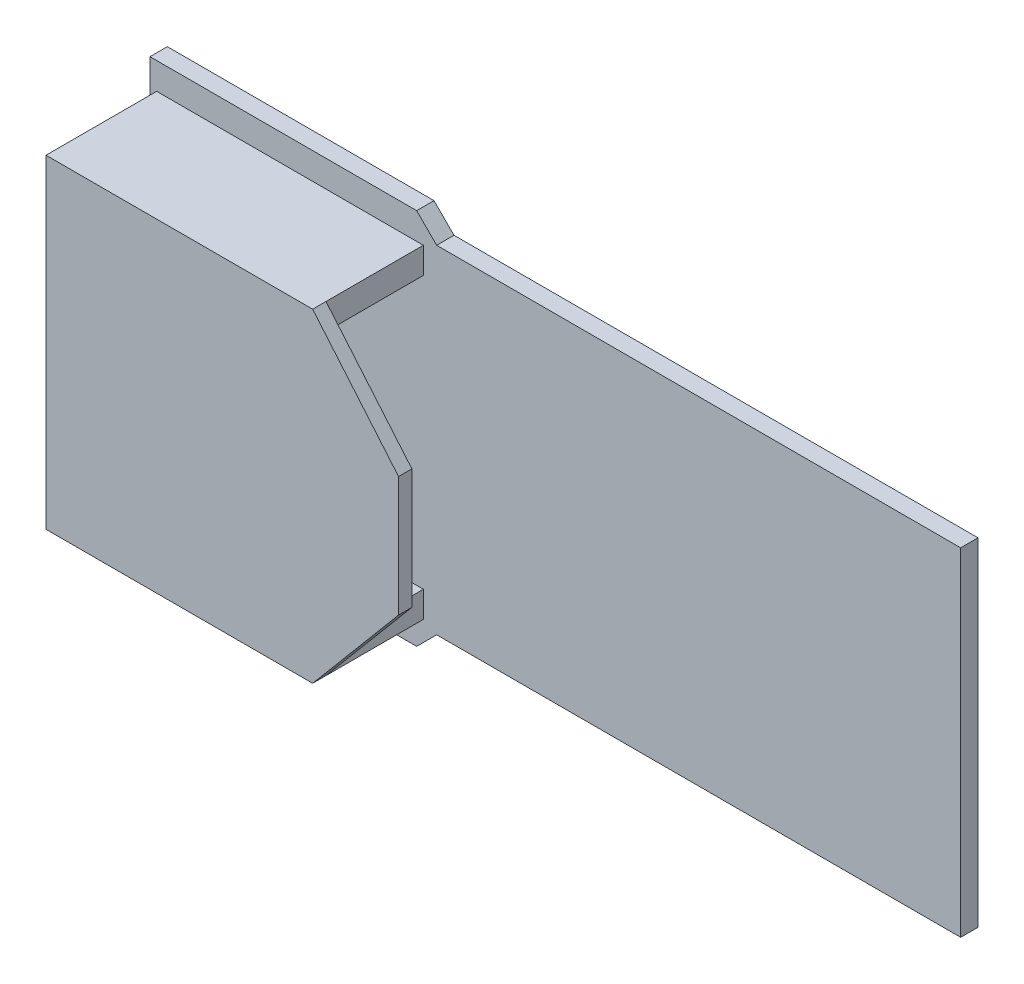
ISO-10303-21;
HEADER;
FILE_DESCRIPTION(('STEP AP214'),'2;1');
FILE_NAME('part.step','',(''),(''),'','','');
FILE_SCHEMA(('AUTOMOTIVE_DESIGN { 1 0 10303 214 1 1 1 1 }'));
ENDSEC;
DATA;
#1=APPLICATION_CONTEXT('core data for automotive mechanical design processes');
#2=APPLICATION_PROTOCOL_DEFINITION('international standard','automotive_design',2000,#1);
#3=PRODUCT_CONTEXT('',#1,'mechanical');
#4=PRODUCT('Part','Part','',(#3));
#5=PRODUCT_RELATED_PRODUCT_CATEGORY('part','',(#4));
#6=PRODUCT_DEFINITION_FORMATION('','',#4);
#7=PRODUCT_DEFINITION_CONTEXT('part definition',#1,'design');
#8=PRODUCT_DEFINITION('design','',#6,#7);
#9=PRODUCT_DEFINITION_SHAPE('','',#8);
#10=(LENGTH_UNIT() NAMED_UNIT(*) SI_UNIT(.MILLI.,.METRE.));
#11=(NAMED_UNIT(*) PLANE_ANGLE_UNIT() SI_UNIT($,.RADIAN.));
#12=(NAMED_UNIT(*) SI_UNIT($,.STERADIAN.) SOLID_ANGLE_UNIT());
#13=UNCERTAINTY_MEASURE_WITH_UNIT(LENGTH_MEASURE(1.E-05),#10,'distance_accuracy_value','');
#14=(GEOMETRIC_REPRESENTATION_CONTEXT(3) GLOBAL_UNCERTAINTY_ASSIGNED_CONTEXT((#13)) GLOBAL_UNIT_ASSIGNED_CONTEXT((#10,
#11,#12)) REPRESENTATION_CONTEXT('',''));
#15=CARTESIAN_POINT('',(0.,0.,0.));
#16=DIRECTION('',(0.,0.,1.));
#17=DIRECTION('',(1.,0.,0.));
#18=AXIS2_PLACEMENT_3D('',#15,#16,#17);
#19=CARTESIAN_POINT('',(0.,0.,1.3));
#20=DIRECTION('',(0.,0.,-1.));
#21=DIRECTION('',(-1.,0.,0.));
#22=AXIS2_PLACEMENT_3D('',#19,#20,#21);
#23=PLANE('',#22);
#24=DIRECTION('',(0.,-1.,0.));
#25=VECTOR('',#24,1.);
#26=CARTESIAN_POINT('',(0.5,10.1907854445176,1.3));
#27=LINE('',#26,#25);
#28=CARTESIAN_POINT('',(0.5,12.15,1.3));
#29=VERTEX_POINT('',#28);
#30=CARTESIAN_POINT('',(0.5,10.1907854445176,1.3));
#31=VERTEX_POINT('',#30);
#32=EDGE_CURVE('E995',#29,#31,#27,.T.);
#33=ORIENTED_EDGE('',*,*,#32,.F.);
#34=DIRECTION('',(-1.,0.,0.));
#35=VECTOR('',#34,1.);
#36=CARTESIAN_POINT('',(0.5,12.15,1.3));
#37=LINE('',#36,#35);
#38=CARTESIAN_POINT('',(20.5,12.15,1.3));
#39=VERTEX_POINT('',#38);
#40=EDGE_CURVE('E267',#39,#29,#37,.T.);
#41=ORIENTED_EDGE('',*,*,#40,.F.);
#42=DIRECTION('',(0.,1.,0.));
#43=VECTOR('',#42,1.);
#44=CARTESIAN_POINT('',(20.5,10.1907854445176,1.3));
#45=LINE('',#44,#43);
#46=CARTESIAN_POINT('',(20.5,10.1907854445176,1.3));
#47=VERTEX_POINT('',#46);
#48=EDGE_CURVE('E998',#47,#39,#45,.T.);
#49=ORIENTED_EDGE('',*,*,#48,.F.);
#50=DIRECTION('',(1.,0.,0.));
#51=VECTOR('',#50,1.);
#52=CARTESIAN_POINT('',(0.5,10.1907854445176,1.3));
#53=LINE('',#52,#51);
#54=EDGE_CURVE('E996',#31,#47,#53,.T.);
#55=ORIENTED_EDGE('',*,*,#54,.F.);
#56=EDGE_LOOP('',(#33,#41,#49,#55));
#57=FACE_BOUND('',#56,.T.);
#58=DIRECTION('',(1.,0.,0.));
#59=VECTOR('',#58,1.);
#60=CARTESIAN_POINT('',(21.5,-12.65,1.3));
#61=LINE('',#60,#59);
#62=CARTESIAN_POINT('',(21.5,-12.65,1.3));
#63=VERTEX_POINT('',#62);
#64=CARTESIAN_POINT('',(60.8,-12.65,1.3));
#65=VERTEX_POINT('',#64);
#66=EDGE_CURVE('E498',#63,#65,#61,.T.);
#67=ORIENTED_EDGE('',*,*,#66,.T.);
#68=DIRECTION('',(0.,1.,0.));
#69=VECTOR('',#68,1.);
#70=CARTESIAN_POINT('',(60.8,12.65,1.3));
#71=LINE('',#70,#69);
#72=CARTESIAN_POINT('',(60.8,12.65,1.3));
#73=VERTEX_POINT('',#72);
#74=EDGE_CURVE('E503',#65,#73,#71,.T.);
#75=ORIENTED_EDGE('',*,*,#74,.T.);
#76=DIRECTION('',(-1.,0.,0.));
#77=VECTOR('',#76,1.);
#78=CARTESIAN_POINT('',(21.5,12.65,1.3));
#79=LINE('',#78,#77);
#80=CARTESIAN_POINT('',(21.5,12.65,1.3));
#81=VERTEX_POINT('',#80);
#82=EDGE_CURVE('E567',#73,#81,#79,.T.);
#83=ORIENTED_EDGE('',*,*,#82,.T.);
#84=DIRECTION('',(-0.707106781186557,0.707106781186539,0.));
#85=VECTOR('',#84,1.);
#86=CARTESIAN_POINT('',(20.,14.15,1.3));
#87=LINE('',#86,#85);
#88=CARTESIAN_POINT('',(20.,14.15,1.3));
#89=VERTEX_POINT('',#88);
#90=EDGE_CURVE('E569',#81,#89,#87,.T.);
#91=ORIENTED_EDGE('',*,*,#90,.T.);
#92=DIRECTION('',(-1.,0.,0.));
#93=VECTOR('',#92,1.);
#94=CARTESIAN_POINT('',(0.,14.15,1.3));
#95=LINE('',#94,#93);
#96=CARTESIAN_POINT('',(0.,14.15,1.3));
#97=VERTEX_POINT('',#96);
#98=EDGE_CURVE('E571',#89,#97,#95,.T.);
#99=ORIENTED_EDGE('',*,*,#98,.T.);
#100=DIRECTION('',(0.,-1.,0.));
#101=VECTOR('',#100,1.);
#102=CARTESIAN_POINT('',(0.,-14.15,1.3));
#103=LINE('',#102,#101);
#104=CARTESIAN_POINT('',(0.,-14.15,1.3));
#105=VERTEX_POINT('',#104);
#106=EDGE_CURVE('E547',#97,#105,#103,.T.);
#107=ORIENTED_EDGE('',*,*,#106,.T.);
#108=DIRECTION('',(1.,0.,0.));
#109=VECTOR('',#108,1.);
#110=CARTESIAN_POINT('',(0.,-14.15,1.3));
#111=LINE('',#110,#109);
#112=CARTESIAN_POINT('',(20.,-14.15,1.3));
#113=VERTEX_POINT('',#112);
#114=EDGE_CURVE('E573',#105,#113,#111,.T.);
#115=ORIENTED_EDGE('',*,*,#114,.T.);
#116=DIRECTION('',(0.707106781186557,0.707106781186538,0.));
#117=VECTOR('',#116,1.);
#118=CARTESIAN_POINT('',(20.,-14.15,1.3));
#119=LINE('',#118,#117);
#120=EDGE_CURVE('E496',#113,#63,#119,.T.);
#121=ORIENTED_EDGE('',*,*,#120,.T.);
#122=EDGE_LOOP('',(#67,#75,#83,#91,#99,#107,#115,#121));
#123=FACE_BOUND('',#122,.T.);
#124=DIRECTION('',(0.,-1.,0.));
#125=VECTOR('',#124,1.);
#126=CARTESIAN_POINT('',(0.5,-10.1907854445176,1.3));
#127=LINE('',#126,#125);
#128=CARTESIAN_POINT('',(0.5,-10.1907854445176,1.3));
#129=VERTEX_POINT('',#128);
#130=CARTESIAN_POINT('',(0.5,-12.15,1.3));
#131=VERTEX_POINT('',#130);
#132=EDGE_CURVE('E317',#129,#131,#127,.T.);
#133=ORIENTED_EDGE('',*,*,#132,.F.);
#134=DIRECTION('',(-1.,0.,0.));
#135=VECTOR('',#134,1.);
#136=CARTESIAN_POINT('',(0.5,-10.1907854445176,1.3));
#137=LINE('',#136,#135);
#138=CARTESIAN_POINT('',(20.5,-10.1907854445176,1.3));
#139=VERTEX_POINT('',#138);
#140=EDGE_CURVE('E314',#139,#129,#137,.T.);
#141=ORIENTED_EDGE('',*,*,#140,.F.);
#142=DIRECTION('',(0.,1.,0.));
#143=VECTOR('',#142,1.);
#144=CARTESIAN_POINT('',(20.5,-10.1907854445176,1.3));
#145=LINE('',#144,#143);
#146=CARTESIAN_POINT('',(20.5,-12.15,1.3));
#147=VERTEX_POINT('',#146);
#148=EDGE_CURVE('E54',#147,#139,#145,.T.);
#149=ORIENTED_EDGE('',*,*,#148,.F.);
#150=DIRECTION('',(1.,0.,0.));
#151=VECTOR('',#150,1.);
#152=CARTESIAN_POINT('',(0.5,-12.15,1.3));
#153=LINE('',#152,#151);
#154=EDGE_CURVE('E49',#131,#147,#153,.T.);
#155=ORIENTED_EDGE('',*,*,#154,.F.);
#156=EDGE_LOOP('',(#133,#141,#149,#155));
#157=FACE_BOUND('',#156,.T.);
#158=ADVANCED_FACE('F32',(#57,#123,#157),#23,.F.);
#159=CARTESIAN_POINT('',(0.,-14.15,1.3));
#160=DIRECTION('',(1.,0.,0.));
#161=DIRECTION('',(0.,0.,-1.));
#162=AXIS2_PLACEMENT_3D('',#159,#160,#161);
#163=PLANE('',#162);
#164=DIRECTION('',(0.,-1.,0.));
#165=VECTOR('',#164,1.);
#166=CARTESIAN_POINT('',(0.,-14.15,0.));
#167=LINE('',#166,#165);
#168=CARTESIAN_POINT('',(0.,14.15,0.));
#169=VERTEX_POINT('',#168);
#170=CARTESIAN_POINT('',(0.,8.15,0.));
#171=VERTEX_POINT('',#170);
#172=EDGE_CURVE('E474',#169,#171,#167,.T.);
#173=ORIENTED_EDGE('',*,*,#172,.T.);
#174=DIRECTION('',(0.,0.,1.));
#175=VECTOR('',#174,1.);
#176=CARTESIAN_POINT('',(0.,8.15,-4.));
#177=LINE('',#176,#175);
#178=CARTESIAN_POINT('',(0.,8.15,-4.));
#179=VERTEX_POINT('',#178);
#180=EDGE_CURVE('E523',#179,#171,#177,.T.);
#181=ORIENTED_EDGE('',*,*,#180,.F.);
#182=DIRECTION('',(0.,-1.,0.));
#183=VECTOR('',#182,1.);
#184=CARTESIAN_POINT('',(0.,8.15,-4.));
#185=LINE('',#184,#183);
#186=CARTESIAN_POINT('',(0.,1.15,-4.));
#187=VERTEX_POINT('',#186);
#188=EDGE_CURVE('E438',#179,#187,#185,.T.);
#189=ORIENTED_EDGE('',*,*,#188,.T.);
#190=DIRECTION('',(0.,0.,1.));
#191=VECTOR('',#190,1.);
#192=CARTESIAN_POINT('',(0.,1.15,-4.));
#193=LINE('',#192,#191);
#194=CARTESIAN_POINT('',(0.,1.15,0.));
#195=VERTEX_POINT('',#194);
#196=EDGE_CURVE('E449',#187,#195,#193,.T.);
#197=ORIENTED_EDGE('',*,*,#196,.T.);
#198=CARTESIAN_POINT('',(0.,-2.15,0.));
#199=VERTEX_POINT('',#198);
#200=EDGE_CURVE('E461',#195,#199,#167,.T.);
#201=ORIENTED_EDGE('',*,*,#200,.T.);
#202=DIRECTION('',(0.,0.,1.));
#203=VECTOR('',#202,1.);
#204=CARTESIAN_POINT('',(0.,-2.15,-6.));
#205=LINE('',#204,#203);
#206=CARTESIAN_POINT('',(0.,-2.15,-6.));
#207=VERTEX_POINT('',#206);
#208=EDGE_CURVE('E435',#207,#199,#205,.T.);
#209=ORIENTED_EDGE('',*,*,#208,.F.);
#210=DIRECTION('',(0.,1.,0.));
#211=VECTOR('',#210,1.);
#212=CARTESIAN_POINT('',(0.,-10.15,-6.));
#213=LINE('',#212,#211);
#214=CARTESIAN_POINT('',(0.,-10.15,-6.));
#215=VERTEX_POINT('',#214);
#216=EDGE_CURVE('E409',#215,#207,#213,.T.);
#217=ORIENTED_EDGE('',*,*,#216,.F.);
#218=DIRECTION('',(0.,0.,1.));
#219=VECTOR('',#218,1.);
#220=CARTESIAN_POINT('',(0.,-10.15,-6.));
#221=LINE('',#220,#219);
#222=CARTESIAN_POINT('',(0.,-10.15,0.));
#223=VERTEX_POINT('',#222);
#224=EDGE_CURVE('E421',#215,#223,#221,.T.);
#225=ORIENTED_EDGE('',*,*,#224,.T.);
#226=CARTESIAN_POINT('',(0.,-14.15,0.));
#227=VERTEX_POINT('',#226);
#228=EDGE_CURVE('E459',#223,#227,#167,.T.);
#229=ORIENTED_EDGE('',*,*,#228,.T.);
#230=DIRECTION('',(0.,0.,-1.));
#231=VECTOR('',#230,1.);
#232=CARTESIAN_POINT('',(0.,-14.15,1.3));
#233=LINE('',#232,#231);
#234=EDGE_CURVE('E488',#105,#227,#233,.T.);
#235=ORIENTED_EDGE('',*,*,#234,.F.);
#236=ORIENTED_EDGE('',*,*,#106,.F.);
#237=DIRECTION('',(0.,0.,-1.));
#238=VECTOR('',#237,1.);
#239=CARTESIAN_POINT('',(0.,14.15,1.3));
#240=LINE('',#239,#238);
#241=EDGE_CURVE('E485',#97,#169,#240,.T.);
#242=ORIENTED_EDGE('',*,*,#241,.T.);
#243=EDGE_LOOP('',(#173,#181,#189,#197,#201,#209,#217,#225,#229,#235,#236,#242));
#244=FACE_BOUND('',#243,.T.);
#245=DIRECTION('',(0.,0.,-1.));
#246=VECTOR('',#245,1.);
#247=CARTESIAN_POINT('',(0.,7.65,-3.5));
#248=LINE('',#247,#246);
#249=CARTESIAN_POINT('',(0.,7.65,-0.5));
#250=VERTEX_POINT('',#249);
#251=CARTESIAN_POINT('',(0.,7.65,-3.5));
#252=VERTEX_POINT('',#251);
#253=EDGE_CURVE('E392',#250,#252,#248,.T.);
#254=ORIENTED_EDGE('',*,*,#253,.F.);
#255=DIRECTION('',(0.,1.,0.));
#256=VECTOR('',#255,1.);
#257=CARTESIAN_POINT('',(0.,1.65,-0.5));
#258=LINE('',#257,#256);
#259=CARTESIAN_POINT('',(0.,1.65,-0.5));
#260=VERTEX_POINT('',#259);
#261=EDGE_CURVE('E376',#260,#250,#258,.T.);
#262=ORIENTED_EDGE('',*,*,#261,.F.);
#263=DIRECTION('',(0.,0.,1.));
#264=VECTOR('',#263,1.);
#265=CARTESIAN_POINT('',(0.,1.65,-3.5));
#266=LINE('',#265,#264);
#267=CARTESIAN_POINT('',(0.,1.65,-3.5));
#268=VERTEX_POINT('',#267);
#269=EDGE_CURVE('E381',#268,#260,#266,.T.);
#270=ORIENTED_EDGE('',*,*,#269,.F.);
#271=DIRECTION('',(0.,-1.,0.));
#272=VECTOR('',#271,1.);
#273=CARTESIAN_POINT('',(0.,1.65,-3.5));
#274=LINE('',#273,#272);
#275=EDGE_CURVE('E395',#252,#268,#274,.T.);
#276=ORIENTED_EDGE('',*,*,#275,.F.);
#277=EDGE_LOOP('',(#254,#262,#270,#276));
#278=FACE_BOUND('',#277,.T.);
#279=DIRECTION('',(0.,1.,0.));
#280=VECTOR('',#279,1.);
#281=CARTESIAN_POINT('',(0.,-9.65,-5.5));
#282=LINE('',#281,#280);
#283=CARTESIAN_POINT('',(0.,-9.65,-5.5));
#284=VERTEX_POINT('',#283);
#285=CARTESIAN_POINT('',(0.,-2.65,-5.5));
#286=VERTEX_POINT('',#285);
#287=EDGE_CURVE('E332',#284,#286,#282,.T.);
#288=ORIENTED_EDGE('',*,*,#287,.T.);
#289=DIRECTION('',(0.,0.,1.));
#290=VECTOR('',#289,1.);
#291=CARTESIAN_POINT('',(0.,-2.65,-5.5));
#292=LINE('',#291,#290);
#293=CARTESIAN_POINT('',(0.,-2.65,-0.5));
#294=VERTEX_POINT('',#293);
#295=EDGE_CURVE('E338',#286,#294,#292,.T.);
#296=ORIENTED_EDGE('',*,*,#295,.T.);
#297=DIRECTION('',(0.,1.,0.));
#298=VECTOR('',#297,1.);
#299=CARTESIAN_POINT('',(0.,-9.65,-0.5));
#300=LINE('',#299,#298);
#301=CARTESIAN_POINT('',(0.,-9.65,-0.5));
#302=VERTEX_POINT('',#301);
#303=EDGE_CURVE('E362',#302,#294,#300,.T.);
#304=ORIENTED_EDGE('',*,*,#303,.F.);
#305=DIRECTION('',(0.,0.,1.));
#306=VECTOR('',#305,1.);
#307=CARTESIAN_POINT('',(0.,-9.65,-5.5));
#308=LINE('',#307,#306);
#309=EDGE_CURVE('E351',#284,#302,#308,.T.);
#310=ORIENTED_EDGE('',*,*,#309,.F.);
#311=EDGE_LOOP('',(#288,#296,#304,#310));
#312=FACE_BOUND('',#311,.T.);
#313=ADVANCED_FACE('F545',(#244,#278,#312),#163,.F.);
#314=CARTESIAN_POINT('',(0.,0.,0.));
#315=DIRECTION('',(0.,0.,-1.));
#316=DIRECTION('',(-1.,0.,0.));
#317=AXIS2_PLACEMENT_3D('',#314,#315,#316);
#318=PLANE('',#317);
#319=DIRECTION('',(0.,1.,0.));
#320=VECTOR('',#319,1.);
#321=CARTESIAN_POINT('',(5.,-10.15,0.));
#322=LINE('',#321,#320);
#323=CARTESIAN_POINT('',(5.,-10.15,0.));
#324=VERTEX_POINT('',#323);
#325=CARTESIAN_POINT('',(5.,-2.15,0.));
#326=VERTEX_POINT('',#325);
#327=EDGE_CURVE('E424',#324,#326,#322,.T.);
#328=ORIENTED_EDGE('',*,*,#327,.T.);
#329=DIRECTION('',(1.,0.,0.));
#330=VECTOR('',#329,1.);
#331=CARTESIAN_POINT('',(0.,-2.15,0.));
#332=LINE('',#331,#330);
#333=EDGE_CURVE('E402',#199,#326,#332,.T.);
#334=ORIENTED_EDGE('',*,*,#333,.F.);
#335=ORIENTED_EDGE('',*,*,#200,.F.);
#336=DIRECTION('',(1.,0.,0.));
#337=VECTOR('',#336,1.);
#338=CARTESIAN_POINT('',(0.,1.15,0.));
#339=LINE('',#338,#337);
#340=CARTESIAN_POINT('',(8.,1.15,0.));
#341=VERTEX_POINT('',#340);
#342=EDGE_CURVE('E437',#195,#341,#339,.T.);
#343=ORIENTED_EDGE('',*,*,#342,.T.);
#344=DIRECTION('',(0.,-1.,0.));
#345=VECTOR('',#344,1.);
#346=CARTESIAN_POINT('',(8.,8.15,0.));
#347=LINE('',#346,#345);
#348=CARTESIAN_POINT('',(8.,8.15,0.));
#349=VERTEX_POINT('',#348);
#350=EDGE_CURVE('E452',#349,#341,#347,.T.);
#351=ORIENTED_EDGE('',*,*,#350,.F.);
#352=DIRECTION('',(1.,0.,0.));
#353=VECTOR('',#352,1.);
#354=CARTESIAN_POINT('',(0.,8.15,0.));
#355=LINE('',#354,#353);
#356=EDGE_CURVE('E442',#171,#349,#355,.T.);
#357=ORIENTED_EDGE('',*,*,#356,.F.);
#358=ORIENTED_EDGE('',*,*,#172,.F.);
#359=DIRECTION('',(-1.,0.,0.));
#360=VECTOR('',#359,1.);
#361=CARTESIAN_POINT('',(0.,14.15,0.));
#362=LINE('',#361,#360);
#363=CARTESIAN_POINT('',(20.,14.15,0.));
#364=VERTEX_POINT('',#363);
#365=EDGE_CURVE('E462',#364,#169,#362,.T.);
#366=ORIENTED_EDGE('',*,*,#365,.F.);
#367=DIRECTION('',(-0.707106781186557,0.707106781186539,0.));
#368=VECTOR('',#367,1.);
#369=CARTESIAN_POINT('',(20.,14.15,0.));
#370=LINE('',#369,#368);
#371=CARTESIAN_POINT('',(21.5,12.65,0.));
#372=VERTEX_POINT('',#371);
#373=EDGE_CURVE('E533',#372,#364,#370,.T.);
#374=ORIENTED_EDGE('',*,*,#373,.F.);
#375=DIRECTION('',(-1.,0.,0.));
#376=VECTOR('',#375,1.);
#377=CARTESIAN_POINT('',(21.5,12.65,0.));
#378=LINE('',#377,#376);
#379=CARTESIAN_POINT('',(60.8,12.65,0.));
#380=VERTEX_POINT('',#379);
#381=EDGE_CURVE('E525',#380,#372,#378,.T.);
#382=ORIENTED_EDGE('',*,*,#381,.F.);
#383=DIRECTION('',(0.,1.,0.));
#384=VECTOR('',#383,1.);
#385=CARTESIAN_POINT('',(60.8,12.65,0.));
#386=LINE('',#385,#384);
#387=CARTESIAN_POINT('',(60.8,-12.65,0.));
#388=VERTEX_POINT('',#387);
#389=EDGE_CURVE('E520',#388,#380,#386,.T.);
#390=ORIENTED_EDGE('',*,*,#389,.F.);
#391=DIRECTION('',(1.,0.,0.));
#392=VECTOR('',#391,1.);
#393=CARTESIAN_POINT('',(21.5,-12.65,0.));
#394=LINE('',#393,#392);
#395=CARTESIAN_POINT('',(21.5,-12.65,0.));
#396=VERTEX_POINT('',#395);
#397=EDGE_CURVE('E518',#396,#388,#394,.T.);
#398=ORIENTED_EDGE('',*,*,#397,.F.);
#399=DIRECTION('',(0.707106781186557,0.707106781186538,0.));
#400=VECTOR('',#399,1.);
#401=CARTESIAN_POINT('',(20.,-14.15,0.));
#402=LINE('',#401,#400);
#403=CARTESIAN_POINT('',(20.,-14.15,0.));
#404=VERTEX_POINT('',#403);
#405=EDGE_CURVE('E497',#404,#396,#402,.T.);
#406=ORIENTED_EDGE('',*,*,#405,.F.);
#407=DIRECTION('',(1.,0.,0.));
#408=VECTOR('',#407,1.);
#409=CARTESIAN_POINT('',(0.,-14.15,0.));
#410=LINE('',#409,#408);
#411=EDGE_CURVE('E467',#227,#404,#410,.T.);
#412=ORIENTED_EDGE('',*,*,#411,.F.);
#413=ORIENTED_EDGE('',*,*,#228,.F.);
#414=DIRECTION('',(1.,0.,0.));
#415=VECTOR('',#414,1.);
#416=CARTESIAN_POINT('',(0.,-10.15,0.));
#417=LINE('',#416,#415);
#418=EDGE_CURVE('E413',#223,#324,#417,.T.);
#419=ORIENTED_EDGE('',*,*,#418,.T.);
#420=EDGE_LOOP('',(#328,#334,#335,#343,#351,#357,#358,#366,#374,#382,#390,#398,#406,#412,#413,#419));
#421=FACE_BOUND('',#420,.T.);
#422=ADVANCED_FACE('F516',(#421),#318,.T.);
#423=CARTESIAN_POINT('',(21.5,-12.65,1.3));
#424=DIRECTION('',(0.,1.,0.));
#425=DIRECTION('',(-1.,0.,0.));
#426=AXIS2_PLACEMENT_3D('',#423,#424,#425);
#427=PLANE('',#426);
#428=ORIENTED_EDGE('',*,*,#397,.T.);
#429=DIRECTION('',(0.,0.,-1.));
#430=VECTOR('',#429,1.);
#431=CARTESIAN_POINT('',(60.8,-12.65,1.3));
#432=LINE('',#431,#430);
#433=EDGE_CURVE('E11',#65,#388,#432,.T.);
#434=ORIENTED_EDGE('',*,*,#433,.F.);
#435=ORIENTED_EDGE('',*,*,#66,.F.);
#436=DIRECTION('',(0.,0.,-1.));
#437=VECTOR('',#436,1.);
#438=CARTESIAN_POINT('',(21.5,-12.65,1.3));
#439=LINE('',#438,#437);
#440=EDGE_CURVE('E494',#63,#396,#439,.T.);
#441=ORIENTED_EDGE('',*,*,#440,.T.);
#442=EDGE_LOOP('',(#428,#434,#435,#441));
#443=FACE_BOUND('',#442,.T.);
#444=ADVANCED_FACE('F34',(#443),#427,.F.);
#445=CARTESIAN_POINT('',(60.8,12.65,1.3));
#446=DIRECTION('',(-1.,0.,0.));
#447=DIRECTION('',(0.,0.,1.));
#448=AXIS2_PLACEMENT_3D('',#445,#446,#447);
#449=PLANE('',#448);
#450=ORIENTED_EDGE('',*,*,#389,.T.);
#451=DIRECTION('',(0.,0.,-1.));
#452=VECTOR('',#451,1.);
#453=CARTESIAN_POINT('',(60.8,12.65,1.3));
#454=LINE('',#453,#452);
#455=EDGE_CURVE('E41',#73,#380,#454,.T.);
#456=ORIENTED_EDGE('',*,*,#455,.F.);
#457=ORIENTED_EDGE('',*,*,#74,.F.);
#458=ORIENTED_EDGE('',*,*,#433,.T.);
#459=EDGE_LOOP('',(#450,#456,#457,#458));
#460=FACE_BOUND('',#459,.T.);
#461=ADVANCED_FACE('F577',(#460),#449,.F.);
#462=CARTESIAN_POINT('',(21.5,12.65,1.3));
#463=DIRECTION('',(0.,-1.,0.));
#464=DIRECTION('',(0.,0.,-1.));
#465=AXIS2_PLACEMENT_3D('',#462,#463,#464);
#466=PLANE('',#465);
#467=ORIENTED_EDGE('',*,*,#381,.T.);
#468=DIRECTION('',(0.,0.,-1.));
#469=VECTOR('',#468,1.);
#470=CARTESIAN_POINT('',(21.5,12.65,1.3));
#471=LINE('',#470,#469);
#472=EDGE_CURVE('E479',#81,#372,#471,.T.);
#473=ORIENTED_EDGE('',*,*,#472,.F.);
#474=ORIENTED_EDGE('',*,*,#82,.F.);
#475=ORIENTED_EDGE('',*,*,#455,.T.);
#476=EDGE_LOOP('',(#467,#473,#474,#475));
#477=FACE_BOUND('',#476,.T.);
#478=ADVANCED_FACE('F583',(#477),#466,.F.);
#479=CARTESIAN_POINT('',(20.,14.15,1.3));
#480=DIRECTION('',(-0.707106781186539,-0.707106781186557,0.));
#481=DIRECTION('',(0.707106781186557,-0.707106781186539,0.));
#482=AXIS2_PLACEMENT_3D('',#479,#480,#481);
#483=PLANE('',#482);
#484=ORIENTED_EDGE('',*,*,#373,.T.);
#485=DIRECTION('',(0.,0.,-1.));
#486=VECTOR('',#485,1.);
#487=CARTESIAN_POINT('',(20.,14.15,1.3));
#488=LINE('',#487,#486);
#489=EDGE_CURVE('E482',#89,#364,#488,.T.);
#490=ORIENTED_EDGE('',*,*,#489,.F.);
#491=ORIENTED_EDGE('',*,*,#90,.F.);
#492=ORIENTED_EDGE('',*,*,#472,.T.);
#493=EDGE_LOOP('',(#484,#490,#491,#492));
#494=FACE_BOUND('',#493,.T.);
#495=ADVANCED_FACE('F584',(#494),#483,.F.);
#496=CARTESIAN_POINT('',(0.,14.15,1.3));
#497=DIRECTION('',(0.,-1.,0.));
#498=DIRECTION('',(0.,0.,-1.));
#499=AXIS2_PLACEMENT_3D('',#496,#497,#498);
#500=PLANE('',#499);
#501=ORIENTED_EDGE('',*,*,#365,.T.);
#502=ORIENTED_EDGE('',*,*,#241,.F.);
#503=ORIENTED_EDGE('',*,*,#98,.F.);
#504=ORIENTED_EDGE('',*,*,#489,.T.);
#505=EDGE_LOOP('',(#501,#502,#503,#504));
#506=FACE_BOUND('',#505,.T.);
#507=ADVANCED_FACE('F540',(#506),#500,.F.);
#508=CARTESIAN_POINT('',(0.,-14.15,1.3));
#509=DIRECTION('',(0.,1.,0.));
#510=DIRECTION('',(0.,0.,1.));
#511=AXIS2_PLACEMENT_3D('',#508,#509,#510);
#512=PLANE('',#511);
#513=ORIENTED_EDGE('',*,*,#411,.T.);
#514=DIRECTION('',(0.,0.,-1.));
#515=VECTOR('',#514,1.);
#516=CARTESIAN_POINT('',(20.,-14.15,1.3));
#517=LINE('',#516,#515);
#518=EDGE_CURVE('E491',#113,#404,#517,.T.);
#519=ORIENTED_EDGE('',*,*,#518,.F.);
#520=ORIENTED_EDGE('',*,*,#114,.F.);
#521=ORIENTED_EDGE('',*,*,#234,.T.);
#522=EDGE_LOOP('',(#513,#519,#520,#521));
#523=FACE_BOUND('',#522,.T.);
#524=ADVANCED_FACE('F508',(#523),#512,.F.);
#525=CARTESIAN_POINT('',(20.,-14.15,1.3));
#526=DIRECTION('',(-0.707106781186538,0.707106781186557,0.));
#527=DIRECTION('',(-0.707106781186557,-0.707106781186538,0.));
#528=AXIS2_PLACEMENT_3D('',#525,#526,#527);
#529=PLANE('',#528);
#530=ORIENTED_EDGE('',*,*,#405,.T.);
#531=ORIENTED_EDGE('',*,*,#440,.F.);
#532=ORIENTED_EDGE('',*,*,#120,.F.);
#533=ORIENTED_EDGE('',*,*,#518,.T.);
#534=EDGE_LOOP('',(#530,#531,#532,#533));
#535=FACE_BOUND('',#534,.T.);
#536=ADVANCED_FACE('F514',(#535),#529,.F.);
#537=CARTESIAN_POINT('',(0.,8.15,-4.));
#538=DIRECTION('',(0.,-1.,0.));
#539=DIRECTION('',(0.,0.,-1.));
#540=AXIS2_PLACEMENT_3D('',#537,#538,#539);
#541=PLANE('',#540);
#542=ORIENTED_EDGE('',*,*,#356,.T.);
#543=DIRECTION('',(0.,0.,1.));
#544=VECTOR('',#543,1.);
#545=CARTESIAN_POINT('',(8.,8.15,-4.));
#546=LINE('',#545,#544);
#547=CARTESIAN_POINT('',(8.,8.15,-4.));
#548=VERTEX_POINT('',#547);
#549=EDGE_CURVE('E528',#548,#349,#546,.T.);
#550=ORIENTED_EDGE('',*,*,#549,.F.);
#551=DIRECTION('',(1.,0.,0.));
#552=VECTOR('',#551,1.);
#553=CARTESIAN_POINT('',(0.,8.15,-4.));
#554=LINE('',#553,#552);
#555=EDGE_CURVE('E447',#179,#548,#554,.T.);
#556=ORIENTED_EDGE('',*,*,#555,.F.);
#557=ORIENTED_EDGE('',*,*,#180,.T.);
#558=EDGE_LOOP('',(#542,#550,#556,#557));
#559=FACE_BOUND('',#558,.T.);
#560=ADVANCED_FACE('F626',(#559),#541,.F.);
#561=CARTESIAN_POINT('',(8.,8.15,-4.));
#562=DIRECTION('',(-1.,0.,0.));
#563=DIRECTION('',(0.,0.,1.));
#564=AXIS2_PLACEMENT_3D('',#561,#562,#563);
#565=PLANE('',#564);
#566=ORIENTED_EDGE('',*,*,#350,.T.);
#567=DIRECTION('',(0.,0.,1.));
#568=VECTOR('',#567,1.);
#569=CARTESIAN_POINT('',(8.,1.15,-4.));
#570=LINE('',#569,#568);
#571=CARTESIAN_POINT('',(8.,1.15,-4.));
#572=VERTEX_POINT('',#571);
#573=EDGE_CURVE('E558',#572,#341,#570,.T.);
#574=ORIENTED_EDGE('',*,*,#573,.F.);
#575=DIRECTION('',(0.,-1.,0.));
#576=VECTOR('',#575,1.);
#577=CARTESIAN_POINT('',(8.,8.15,-4.));
#578=LINE('',#577,#576);
#579=EDGE_CURVE('E445',#548,#572,#578,.T.);
#580=ORIENTED_EDGE('',*,*,#579,.F.);
#581=ORIENTED_EDGE('',*,*,#549,.T.);
#582=EDGE_LOOP('',(#566,#574,#580,#581));
#583=FACE_BOUND('',#582,.T.);
#584=ADVANCED_FACE('F915',(#583),#565,.F.);
#585=CARTESIAN_POINT('',(0.,1.15,-4.));
#586=DIRECTION('',(0.,-1.,0.));
#587=DIRECTION('',(1.,0.,0.));
#588=AXIS2_PLACEMENT_3D('',#585,#586,#587);
#589=PLANE('',#588);
#590=ORIENTED_EDGE('',*,*,#342,.F.);
#591=ORIENTED_EDGE('',*,*,#196,.F.);
#592=DIRECTION('',(1.,0.,0.));
#593=VECTOR('',#592,1.);
#594=CARTESIAN_POINT('',(0.,1.15,-4.));
#595=LINE('',#594,#593);
#596=EDGE_CURVE('E441',#187,#572,#595,.T.);
#597=ORIENTED_EDGE('',*,*,#596,.T.);
#598=ORIENTED_EDGE('',*,*,#573,.T.);
#599=EDGE_LOOP('',(#590,#591,#597,#598));
#600=FACE_BOUND('',#599,.T.);
#601=ADVANCED_FACE('F620',(#600),#589,.T.);
#602=CARTESIAN_POINT('',(0.,0.,-4.));
#603=DIRECTION('',(0.,0.,1.));
#604=DIRECTION('',(1.,0.,0.));
#605=AXIS2_PLACEMENT_3D('',#602,#603,#604);
#606=PLANE('',#605);
#607=ORIENTED_EDGE('',*,*,#188,.F.);
#608=ORIENTED_EDGE('',*,*,#555,.T.);
#609=ORIENTED_EDGE('',*,*,#579,.T.);
#610=ORIENTED_EDGE('',*,*,#596,.F.);
#611=EDGE_LOOP('',(#607,#608,#609,#610));
#612=FACE_BOUND('',#611,.T.);
#613=ADVANCED_FACE('F900',(#612),#606,.F.);
#614=CARTESIAN_POINT('',(0.,-2.15,-6.));
#615=DIRECTION('',(0.,-1.,0.));
#616=DIRECTION('',(1.,0.,0.));
#617=AXIS2_PLACEMENT_3D('',#614,#615,#616);
#618=PLANE('',#617);
#619=ORIENTED_EDGE('',*,*,#333,.T.);
#620=DIRECTION('',(0.,0.,1.));
#621=VECTOR('',#620,1.);
#622=CARTESIAN_POINT('',(5.,-2.15,-6.));
#623=LINE('',#622,#621);
#624=CARTESIAN_POINT('',(5.,-2.15,-6.));
#625=VERTEX_POINT('',#624);
#626=EDGE_CURVE('E433',#625,#326,#623,.T.);
#627=ORIENTED_EDGE('',*,*,#626,.F.);
#628=DIRECTION('',(1.,0.,0.));
#629=VECTOR('',#628,1.);
#630=CARTESIAN_POINT('',(0.,-2.15,-6.));
#631=LINE('',#630,#629);
#632=EDGE_CURVE('E412',#207,#625,#631,.T.);
#633=ORIENTED_EDGE('',*,*,#632,.F.);
#634=ORIENTED_EDGE('',*,*,#208,.T.);
#635=EDGE_LOOP('',(#619,#627,#633,#634));
#636=FACE_BOUND('',#635,.T.);
#637=ADVANCED_FACE('F596',(#636),#618,.F.);
#638=CARTESIAN_POINT('',(5.,-10.15,-6.));
#639=DIRECTION('',(1.,0.,0.));
#640=DIRECTION('',(0.,0.,-1.));
#641=AXIS2_PLACEMENT_3D('',#638,#639,#640);
#642=PLANE('',#641);
#643=ORIENTED_EDGE('',*,*,#327,.F.);
#644=DIRECTION('',(0.,0.,1.));
#645=VECTOR('',#644,1.);
#646=CARTESIAN_POINT('',(5.,-10.15,-6.));
#647=LINE('',#646,#645);
#648=CARTESIAN_POINT('',(5.,-10.15,-6.));
#649=VERTEX_POINT('',#648);
#650=EDGE_CURVE('E431',#649,#324,#647,.T.);
#651=ORIENTED_EDGE('',*,*,#650,.F.);
#652=DIRECTION('',(0.,1.,0.));
#653=VECTOR('',#652,1.);
#654=CARTESIAN_POINT('',(5.,-10.15,-6.));
#655=LINE('',#654,#653);
#656=EDGE_CURVE('E415',#649,#625,#655,.T.);
#657=ORIENTED_EDGE('',*,*,#656,.T.);
#658=ORIENTED_EDGE('',*,*,#626,.T.);
#659=EDGE_LOOP('',(#643,#651,#657,#658));
#660=FACE_BOUND('',#659,.T.);
#661=ADVANCED_FACE('F593',(#660),#642,.T.);
#662=CARTESIAN_POINT('',(0.,-10.15,-6.));
#663=DIRECTION('',(0.,-1.,0.));
#664=DIRECTION('',(1.,0.,0.));
#665=AXIS2_PLACEMENT_3D('',#662,#663,#664);
#666=PLANE('',#665);
#667=ORIENTED_EDGE('',*,*,#418,.F.);
#668=ORIENTED_EDGE('',*,*,#224,.F.);
#669=DIRECTION('',(1.,0.,0.));
#670=VECTOR('',#669,1.);
#671=CARTESIAN_POINT('',(0.,-10.15,-6.));
#672=LINE('',#671,#670);
#673=EDGE_CURVE('E418',#215,#649,#672,.T.);
#674=ORIENTED_EDGE('',*,*,#673,.T.);
#675=ORIENTED_EDGE('',*,*,#650,.T.);
#676=EDGE_LOOP('',(#667,#668,#674,#675));
#677=FACE_BOUND('',#676,.T.);
#678=ADVANCED_FACE('F589',(#677),#666,.T.);
#679=CARTESIAN_POINT('',(0.,0.,-6.));
#680=DIRECTION('',(0.,0.,-1.));
#681=DIRECTION('',(-1.,0.,0.));
#682=AXIS2_PLACEMENT_3D('',#679,#680,#681);
#683=PLANE('',#682);
#684=ORIENTED_EDGE('',*,*,#216,.T.);
#685=ORIENTED_EDGE('',*,*,#632,.T.);
#686=ORIENTED_EDGE('',*,*,#656,.F.);
#687=ORIENTED_EDGE('',*,*,#673,.F.);
#688=EDGE_LOOP('',(#684,#685,#686,#687));
#689=FACE_BOUND('',#688,.T.);
#690=ADVANCED_FACE('F599',(#689),#683,.T.);
#691=CARTESIAN_POINT('',(7.,1.65,-0.5));
#692=DIRECTION('',(0.,0.,1.));
#693=DIRECTION('',(1.,0.,0.));
#694=AXIS2_PLACEMENT_3D('',#691,#692,#693);
#695=PLANE('',#694);
#696=ORIENTED_EDGE('',*,*,#261,.T.);
#697=DIRECTION('',(-1.,0.,0.));
#698=VECTOR('',#697,1.);
#699=CARTESIAN_POINT('',(7.,7.65,-0.5));
#700=LINE('',#699,#698);
#701=CARTESIAN_POINT('',(7.,7.65,-0.5));
#702=VERTEX_POINT('',#701);
#703=EDGE_CURVE('E390',#702,#250,#700,.T.);
#704=ORIENTED_EDGE('',*,*,#703,.F.);
#705=DIRECTION('',(0.,1.,0.));
#706=VECTOR('',#705,1.);
#707=CARTESIAN_POINT('',(7.,1.65,-0.5));
#708=LINE('',#707,#706);
#709=CARTESIAN_POINT('',(7.,1.65,-0.5));
#710=VERTEX_POINT('',#709);
#711=EDGE_CURVE('E377',#710,#702,#708,.T.);
#712=ORIENTED_EDGE('',*,*,#711,.F.);
#713=DIRECTION('',(-1.,0.,0.));
#714=VECTOR('',#713,1.);
#715=CARTESIAN_POINT('',(7.,1.65,-0.5));
#716=LINE('',#715,#714);
#717=EDGE_CURVE('E400',#710,#260,#716,.T.);
#718=ORIENTED_EDGE('',*,*,#717,.T.);
#719=EDGE_LOOP('',(#696,#704,#712,#718));
#720=FACE_BOUND('',#719,.T.);
#721=ADVANCED_FACE('F601',(#720),#695,.F.);
#722=CARTESIAN_POINT('',(7.,1.65,-3.5));
#723=DIRECTION('',(0.,-1.,0.));
#724=DIRECTION('',(0.,0.,-1.));
#725=AXIS2_PLACEMENT_3D('',#722,#723,#724);
#726=PLANE('',#725);
#727=ORIENTED_EDGE('',*,*,#269,.T.);
#728=ORIENTED_EDGE('',*,*,#717,.F.);
#729=DIRECTION('',(0.,0.,1.));
#730=VECTOR('',#729,1.);
#731=CARTESIAN_POINT('',(7.,1.65,-3.5));
#732=LINE('',#731,#730);
#733=CARTESIAN_POINT('',(7.,1.65,-3.5));
#734=VERTEX_POINT('',#733);
#735=EDGE_CURVE('E387',#734,#710,#732,.T.);
#736=ORIENTED_EDGE('',*,*,#735,.F.);
#737=DIRECTION('',(-1.,0.,0.));
#738=VECTOR('',#737,1.);
#739=CARTESIAN_POINT('',(7.,1.65,-3.5));
#740=LINE('',#739,#738);
#741=EDGE_CURVE('E403',#734,#268,#740,.T.);
#742=ORIENTED_EDGE('',*,*,#741,.T.);
#743=EDGE_LOOP('',(#727,#728,#736,#742));
#744=FACE_BOUND('',#743,.T.);
#745=ADVANCED_FACE('F607',(#744),#726,.F.);
#746=CARTESIAN_POINT('',(7.,1.65,-3.5));
#747=DIRECTION('',(0.,0.,-1.));
#748=DIRECTION('',(-1.,0.,0.));
#749=AXIS2_PLACEMENT_3D('',#746,#747,#748);
#750=PLANE('',#749);
#751=ORIENTED_EDGE('',*,*,#275,.T.);
#752=ORIENTED_EDGE('',*,*,#741,.F.);
#753=DIRECTION('',(0.,-1.,0.));
#754=VECTOR('',#753,1.);
#755=CARTESIAN_POINT('',(7.,1.65,-3.5));
#756=LINE('',#755,#754);
#757=CARTESIAN_POINT('',(7.,7.65,-3.5));
#758=VERTEX_POINT('',#757);
#759=EDGE_CURVE('E384',#758,#734,#756,.T.);
#760=ORIENTED_EDGE('',*,*,#759,.F.);
#761=DIRECTION('',(-1.,0.,0.));
#762=VECTOR('',#761,1.);
#763=CARTESIAN_POINT('',(7.,7.65,-3.5));
#764=LINE('',#763,#762);
#765=EDGE_CURVE('E405',#758,#252,#764,.T.);
#766=ORIENTED_EDGE('',*,*,#765,.T.);
#767=EDGE_LOOP('',(#751,#752,#760,#766));
#768=FACE_BOUND('',#767,.T.);
#769=ADVANCED_FACE('F838',(#768),#750,.F.);
#770=CARTESIAN_POINT('',(7.,7.65,-3.5));
#771=DIRECTION('',(0.,1.,0.));
#772=DIRECTION('',(0.,0.,1.));
#773=AXIS2_PLACEMENT_3D('',#770,#771,#772);
#774=PLANE('',#773);
#775=ORIENTED_EDGE('',*,*,#253,.T.);
#776=ORIENTED_EDGE('',*,*,#765,.F.);
#777=DIRECTION('',(0.,0.,-1.));
#778=VECTOR('',#777,1.);
#779=CARTESIAN_POINT('',(7.,7.65,-3.5));
#780=LINE('',#779,#778);
#781=EDGE_CURVE('E380',#702,#758,#780,.T.);
#782=ORIENTED_EDGE('',*,*,#781,.F.);
#783=ORIENTED_EDGE('',*,*,#703,.T.);
#784=EDGE_LOOP('',(#775,#776,#782,#783));
#785=FACE_BOUND('',#784,.T.);
#786=ADVANCED_FACE('F834',(#785),#774,.F.);
#787=CARTESIAN_POINT('',(7.,0.,0.));
#788=DIRECTION('',(1.,0.,0.));
#789=DIRECTION('',(0.,0.,-1.));
#790=AXIS2_PLACEMENT_3D('',#787,#788,#789);
#791=PLANE('',#790);
#792=ORIENTED_EDGE('',*,*,#711,.T.);
#793=ORIENTED_EDGE('',*,*,#781,.T.);
#794=ORIENTED_EDGE('',*,*,#759,.T.);
#795=ORIENTED_EDGE('',*,*,#735,.T.);
#796=EDGE_LOOP('',(#792,#793,#794,#795));
#797=FACE_BOUND('',#796,.T.);
#798=ADVANCED_FACE('F658',(#797),#791,.F.);
#799=CARTESIAN_POINT('',(4.,-9.65,-5.5));
#800=DIRECTION('',(0.,0.,1.));
#801=DIRECTION('',(1.,0.,0.));
#802=AXIS2_PLACEMENT_3D('',#799,#800,#801);
#803=PLANE('',#802);
#804=ORIENTED_EDGE('',*,*,#287,.F.);
#805=DIRECTION('',(-1.,0.,0.));
#806=VECTOR('',#805,1.);
#807=CARTESIAN_POINT('',(4.,-9.65,-5.5));
#808=LINE('',#807,#806);
#809=CARTESIAN_POINT('',(4.,-9.65,-5.5));
#810=VERTEX_POINT('',#809);
#811=EDGE_CURVE('E358',#810,#284,#808,.T.);
#812=ORIENTED_EDGE('',*,*,#811,.F.);
#813=DIRECTION('',(0.,1.,0.));
#814=VECTOR('',#813,1.);
#815=CARTESIAN_POINT('',(4.,-9.65,-5.5));
#816=LINE('',#815,#814);
#817=CARTESIAN_POINT('',(4.,-2.65,-5.5));
#818=VERTEX_POINT('',#817);
#819=EDGE_CURVE('E347',#810,#818,#816,.T.);
#820=ORIENTED_EDGE('',*,*,#819,.T.);
#821=DIRECTION('',(-1.,0.,0.));
#822=VECTOR('',#821,1.);
#823=CARTESIAN_POINT('',(4.,-2.65,-5.5));
#824=LINE('',#823,#822);
#825=EDGE_CURVE('E373',#818,#286,#824,.T.);
#826=ORIENTED_EDGE('',*,*,#825,.T.);
#827=EDGE_LOOP('',(#804,#812,#820,#826));
#828=FACE_BOUND('',#827,.T.);
#829=ADVANCED_FACE('F663',(#828),#803,.T.);
#830=CARTESIAN_POINT('',(4.,-2.65,-5.5));
#831=DIRECTION('',(0.,-1.,0.));
#832=DIRECTION('',(0.,0.,-1.));
#833=AXIS2_PLACEMENT_3D('',#830,#831,#832);
#834=PLANE('',#833);
#835=ORIENTED_EDGE('',*,*,#295,.F.);
#836=ORIENTED_EDGE('',*,*,#825,.F.);
#837=DIRECTION('',(0.,0.,1.));
#838=VECTOR('',#837,1.);
#839=CARTESIAN_POINT('',(4.,-2.65,-5.5));
#840=LINE('',#839,#838);
#841=CARTESIAN_POINT('',(4.,-2.65,-0.5));
#842=VERTEX_POINT('',#841);
#843=EDGE_CURVE('E350',#818,#842,#840,.T.);
#844=ORIENTED_EDGE('',*,*,#843,.T.);
#845=DIRECTION('',(-1.,0.,0.));
#846=VECTOR('',#845,1.);
#847=CARTESIAN_POINT('',(4.,-2.65,-0.5));
#848=LINE('',#847,#846);
#849=EDGE_CURVE('E371',#842,#294,#848,.T.);
#850=ORIENTED_EDGE('',*,*,#849,.T.);
#851=EDGE_LOOP('',(#835,#836,#844,#850));
#852=FACE_BOUND('',#851,.T.);
#853=ADVANCED_FACE('F667',(#852),#834,.T.);
#854=CARTESIAN_POINT('',(4.,-9.65,-0.5));
#855=DIRECTION('',(0.,0.,1.));
#856=DIRECTION('',(1.,0.,0.));
#857=AXIS2_PLACEMENT_3D('',#854,#855,#856);
#858=PLANE('',#857);
#859=ORIENTED_EDGE('',*,*,#303,.T.);
#860=ORIENTED_EDGE('',*,*,#849,.F.);
#861=DIRECTION('',(0.,1.,0.));
#862=VECTOR('',#861,1.);
#863=CARTESIAN_POINT('',(4.,-9.65,-0.5));
#864=LINE('',#863,#862);
#865=CARTESIAN_POINT('',(4.,-9.65,-0.5));
#866=VERTEX_POINT('',#865);
#867=EDGE_CURVE('E353',#866,#842,#864,.T.);
#868=ORIENTED_EDGE('',*,*,#867,.F.);
#869=DIRECTION('',(-1.,0.,0.));
#870=VECTOR('',#869,1.);
#871=CARTESIAN_POINT('',(4.,-9.65,-0.5));
#872=LINE('',#871,#870);
#873=EDGE_CURVE('E369',#866,#302,#872,.T.);
#874=ORIENTED_EDGE('',*,*,#873,.T.);
#875=EDGE_LOOP('',(#859,#860,#868,#874));
#876=FACE_BOUND('',#875,.T.);
#877=ADVANCED_FACE('F677',(#876),#858,.F.);
#878=CARTESIAN_POINT('',(4.,-9.65,-5.5));
#879=DIRECTION('',(0.,-1.,0.));
#880=DIRECTION('',(0.,0.,-1.));
#881=AXIS2_PLACEMENT_3D('',#878,#879,#880);
#882=PLANE('',#881);
#883=ORIENTED_EDGE('',*,*,#309,.T.);
#884=ORIENTED_EDGE('',*,*,#873,.F.);
#885=DIRECTION('',(0.,0.,1.));
#886=VECTOR('',#885,1.);
#887=CARTESIAN_POINT('',(4.,-9.65,-5.5));
#888=LINE('',#887,#886);
#889=EDGE_CURVE('E356',#810,#866,#888,.T.);
#890=ORIENTED_EDGE('',*,*,#889,.F.);
#891=ORIENTED_EDGE('',*,*,#811,.T.);
#892=EDGE_LOOP('',(#883,#884,#890,#891));
#893=FACE_BOUND('',#892,.T.);
#894=ADVANCED_FACE('F687',(#893),#882,.F.);
#895=CARTESIAN_POINT('',(4.,0.,0.));
#896=DIRECTION('',(1.,0.,0.));
#897=DIRECTION('',(0.,0.,-1.));
#898=AXIS2_PLACEMENT_3D('',#895,#896,#897);
#899=PLANE('',#898);
#900=ORIENTED_EDGE('',*,*,#819,.F.);
#901=ORIENTED_EDGE('',*,*,#889,.T.);
#902=ORIENTED_EDGE('',*,*,#867,.T.);
#903=ORIENTED_EDGE('',*,*,#843,.F.);
#904=EDGE_LOOP('',(#900,#901,#902,#903));
#905=FACE_BOUND('',#904,.T.);
#906=ADVANCED_FACE('F697',(#905),#899,.F.);
#907=CARTESIAN_POINT('',(0.5,10.1907854445176,8.6));
#908=DIRECTION('',(1.,0.,0.));
#909=DIRECTION('',(0.,0.,-1.));
#910=AXIS2_PLACEMENT_3D('',#907,#908,#909);
#911=PLANE('',#910);
#912=ORIENTED_EDGE('',*,*,#32,.T.);
#913=DIRECTION('',(0.,0.,-1.));
#914=VECTOR('',#913,1.);
#915=CARTESIAN_POINT('',(0.5,10.1907854445176,8.6));
#916=LINE('',#915,#914);
#917=CARTESIAN_POINT('',(0.5,10.1907854445176,8.6));
#918=VERTEX_POINT('',#917);
#919=EDGE_CURVE('E330',#918,#31,#916,.T.);
#920=ORIENTED_EDGE('',*,*,#919,.F.);
#921=DIRECTION('',(0.,-1.,0.));
#922=VECTOR('',#921,1.);
#923=CARTESIAN_POINT('',(0.5,12.15,8.6));
#924=LINE('',#923,#922);
#925=CARTESIAN_POINT('',(0.5,-10.1907854445176,8.6));
#926=VERTEX_POINT('',#925);
#927=EDGE_CURVE('E304',#918,#926,#924,.T.);
#928=ORIENTED_EDGE('',*,*,#927,.T.);
#929=DIRECTION('',(0.,0.,-1.));
#930=VECTOR('',#929,1.);
#931=CARTESIAN_POINT('',(0.5,-10.1907854445176,8.6));
#932=LINE('',#931,#930);
#933=EDGE_CURVE('E323',#926,#129,#932,.T.);
#934=ORIENTED_EDGE('',*,*,#933,.T.);
#935=ORIENTED_EDGE('',*,*,#132,.T.);
#936=DIRECTION('',(0.,0.,-1.));
#937=VECTOR('',#936,1.);
#938=CARTESIAN_POINT('',(0.5,-12.15,8.6));
#939=LINE('',#938,#937);
#940=CARTESIAN_POINT('',(0.5,-12.15,9.6));
#941=VERTEX_POINT('',#940);
#942=EDGE_CURVE('E277',#941,#131,#939,.T.);
#943=ORIENTED_EDGE('',*,*,#942,.F.);
#944=DIRECTION('',(0.,-1.,0.));
#945=VECTOR('',#944,1.);
#946=CARTESIAN_POINT('',(0.5,12.15,9.6));
#947=LINE('',#946,#945);
#948=CARTESIAN_POINT('',(0.5,12.15,9.6));
#949=VERTEX_POINT('',#948);
#950=EDGE_CURVE('E274',#949,#941,#947,.T.);
#951=ORIENTED_EDGE('',*,*,#950,.F.);
#952=DIRECTION('',(0.,0.,-1.));
#953=VECTOR('',#952,1.);
#954=CARTESIAN_POINT('',(0.5,12.15,8.6));
#955=LINE('',#954,#953);
#956=EDGE_CURVE('E260',#949,#29,#955,.T.);
#957=ORIENTED_EDGE('',*,*,#956,.T.);
#958=EDGE_LOOP('',(#912,#920,#928,#934,#935,#943,#951,#957));
#959=FACE_BOUND('',#958,.T.);
#960=ADVANCED_FACE('F275',(#959),#911,.F.);
#961=CARTESIAN_POINT('',(0.5,10.1907854445176,8.6));
#962=DIRECTION('',(0.,1.,0.));
#963=DIRECTION('',(0.,0.,1.));
#964=AXIS2_PLACEMENT_3D('',#961,#962,#963);
#965=PLANE('',#964);
#966=ORIENTED_EDGE('',*,*,#54,.T.);
#967=DIRECTION('',(0.,0.,-1.));
#968=VECTOR('',#967,1.);
#969=CARTESIAN_POINT('',(20.5,10.1907854445176,8.6));
#970=LINE('',#969,#968);
#971=CARTESIAN_POINT('',(20.5,10.1907854445176,8.6));
#972=VERTEX_POINT('',#971);
#973=EDGE_CURVE('E333',#972,#47,#970,.T.);
#974=ORIENTED_EDGE('',*,*,#973,.F.);
#975=DIRECTION('',(1.,0.,0.));
#976=VECTOR('',#975,1.);
#977=CARTESIAN_POINT('',(0.5,10.1907854445176,8.6));
#978=LINE('',#977,#976);
#979=EDGE_CURVE('E326',#918,#972,#978,.T.);
#980=ORIENTED_EDGE('',*,*,#979,.F.);
#981=ORIENTED_EDGE('',*,*,#919,.T.);
#982=EDGE_LOOP('',(#966,#974,#980,#981));
#983=FACE_BOUND('',#982,.T.);
#984=ADVANCED_FACE('F721',(#983),#965,.F.);
#985=CARTESIAN_POINT('',(20.5,10.1907854445176,8.6));
#986=DIRECTION('',(-1.,0.,0.));
#987=DIRECTION('',(0.,0.,1.));
#988=AXIS2_PLACEMENT_3D('',#985,#986,#987);
#989=PLANE('',#988);
#990=ORIENTED_EDGE('',*,*,#48,.T.);
#991=DIRECTION('',(0.,0.,-1.));
#992=VECTOR('',#991,1.);
#993=CARTESIAN_POINT('',(20.5,12.15,8.6));
#994=LINE('',#993,#992);
#995=CARTESIAN_POINT('',(20.5,12.15,8.6));
#996=VERTEX_POINT('',#995);
#997=EDGE_CURVE('E270',#996,#39,#994,.T.);
#998=ORIENTED_EDGE('',*,*,#997,.F.);
#999=DIRECTION('',(0.,1.,0.));
#1000=VECTOR('',#999,1.);
#1001=CARTESIAN_POINT('',(20.5,10.1907854445176,8.6));
#1002=LINE('',#1001,#1000);
#1003=EDGE_CURVE('E271',#972,#996,#1002,.T.);
#1004=ORIENTED_EDGE('',*,*,#1003,.F.);
#1005=ORIENTED_EDGE('',*,*,#973,.T.);
#1006=EDGE_LOOP('',(#990,#998,#1004,#1005));
#1007=FACE_BOUND('',#1006,.T.);
#1008=ADVANCED_FACE('F732',(#1007),#989,.F.);
#1009=CARTESIAN_POINT('',(0.5,12.15,8.6));
#1010=DIRECTION('',(0.,-1.,0.));
#1011=DIRECTION('',(0.,0.,-1.));
#1012=AXIS2_PLACEMENT_3D('',#1009,#1010,#1011);
#1013=PLANE('',#1012);
#1014=ORIENTED_EDGE('',*,*,#40,.T.);
#1015=ORIENTED_EDGE('',*,*,#956,.F.);
#1016=DIRECTION('',(-1.,0.,0.));
#1017=VECTOR('',#1016,1.);
#1018=CARTESIAN_POINT('',(0.5,12.15,9.6));
#1019=LINE('',#1018,#1017);
#1020=CARTESIAN_POINT('',(20.5,12.15,9.6));
#1021=VERTEX_POINT('',#1020);
#1022=EDGE_CURVE('E265',#1021,#949,#1019,.T.);
#1023=ORIENTED_EDGE('',*,*,#1022,.F.);
#1024=DIRECTION('',(0.,0.,-1.));
#1025=VECTOR('',#1024,1.);
#1026=CARTESIAN_POINT('',(20.5,12.15,9.6));
#1027=LINE('',#1026,#1025);
#1028=EDGE_CURVE('E298',#1021,#996,#1027,.T.);
#1029=ORIENTED_EDGE('',*,*,#1028,.T.);
#1030=ORIENTED_EDGE('',*,*,#997,.T.);
#1031=EDGE_LOOP('',(#1014,#1015,#1023,#1029,#1030));
#1032=FACE_BOUND('',#1031,.T.);
#1033=ADVANCED_FACE('F262',(#1032),#1013,.F.);
#1034=CARTESIAN_POINT('',(0.5,-12.15,8.6));
#1035=DIRECTION('',(0.,1.,0.));
#1036=DIRECTION('',(0.,0.,1.));
#1037=AXIS2_PLACEMENT_3D('',#1034,#1035,#1036);
#1038=PLANE('',#1037);
#1039=ORIENTED_EDGE('',*,*,#154,.T.);
#1040=DIRECTION('',(0.,0.,-1.));
#1041=VECTOR('',#1040,1.);
#1042=CARTESIAN_POINT('',(20.5,-12.15,8.6));
#1043=LINE('',#1042,#1041);
#1044=CARTESIAN_POINT('',(20.5,-12.15,8.6));
#1045=VERTEX_POINT('',#1044);
#1046=EDGE_CURVE('E1000',#1045,#147,#1043,.T.);
#1047=ORIENTED_EDGE('',*,*,#1046,.F.);
#1048=DIRECTION('',(0.,0.,-1.));
#1049=VECTOR('',#1048,1.);
#1050=CARTESIAN_POINT('',(20.5,-12.15,9.6));
#1051=LINE('',#1050,#1049);
#1052=CARTESIAN_POINT('',(20.5,-12.15,9.6));
#1053=VERTEX_POINT('',#1052);
#1054=EDGE_CURVE('E308',#1053,#1045,#1051,.T.);
#1055=ORIENTED_EDGE('',*,*,#1054,.F.);
#1056=DIRECTION('',(1.,0.,0.));
#1057=VECTOR('',#1056,1.);
#1058=CARTESIAN_POINT('',(0.5,-12.15,9.6));
#1059=LINE('',#1058,#1057);
#1060=EDGE_CURVE('E280',#941,#1053,#1059,.T.);
#1061=ORIENTED_EDGE('',*,*,#1060,.F.);
#1062=ORIENTED_EDGE('',*,*,#942,.T.);
#1063=EDGE_LOOP('',(#1039,#1047,#1055,#1061,#1062));
#1064=FACE_BOUND('',#1063,.T.);
#1065=ADVANCED_FACE('F749',(#1064),#1038,.F.);
#1066=CARTESIAN_POINT('',(20.5,-10.1907854445176,8.6));
#1067=DIRECTION('',(-1.,0.,0.));
#1068=DIRECTION('',(0.,0.,1.));
#1069=AXIS2_PLACEMENT_3D('',#1066,#1067,#1068);
#1070=PLANE('',#1069);
#1071=ORIENTED_EDGE('',*,*,#148,.T.);
#1072=DIRECTION('',(0.,0.,-1.));
#1073=VECTOR('',#1072,1.);
#1074=CARTESIAN_POINT('',(20.5,-10.1907854445176,8.6));
#1075=LINE('',#1074,#1073);
#1076=CARTESIAN_POINT('',(20.5,-10.1907854445176,8.6));
#1077=VERTEX_POINT('',#1076);
#1078=EDGE_CURVE('E1023',#1077,#139,#1075,.T.);
#1079=ORIENTED_EDGE('',*,*,#1078,.F.);
#1080=DIRECTION('',(0.,1.,0.));
#1081=VECTOR('',#1080,1.);
#1082=CARTESIAN_POINT('',(20.5,-10.1907854445176,8.6));
#1083=LINE('',#1082,#1081);
#1084=EDGE_CURVE('E310',#1045,#1077,#1083,.T.);
#1085=ORIENTED_EDGE('',*,*,#1084,.F.);
#1086=ORIENTED_EDGE('',*,*,#1046,.T.);
#1087=EDGE_LOOP('',(#1071,#1079,#1085,#1086));
#1088=FACE_BOUND('',#1087,.T.);
#1089=ADVANCED_FACE('F758',(#1088),#1070,.F.);
#1090=CARTESIAN_POINT('',(0.5,-10.1907854445176,8.6));
#1091=DIRECTION('',(0.,-1.,0.));
#1092=DIRECTION('',(0.,0.,-1.));
#1093=AXIS2_PLACEMENT_3D('',#1090,#1091,#1092);
#1094=PLANE('',#1093);
#1095=ORIENTED_EDGE('',*,*,#140,.T.);
#1096=ORIENTED_EDGE('',*,*,#933,.F.);
#1097=DIRECTION('',(-1.,0.,0.));
#1098=VECTOR('',#1097,1.);
#1099=CARTESIAN_POINT('',(0.5,-10.1907854445176,8.6));
#1100=LINE('',#1099,#1098);
#1101=EDGE_CURVE('E313',#1077,#926,#1100,.T.);
#1102=ORIENTED_EDGE('',*,*,#1101,.F.);
#1103=ORIENTED_EDGE('',*,*,#1078,.T.);
#1104=EDGE_LOOP('',(#1095,#1096,#1102,#1103));
#1105=FACE_BOUND('',#1104,.T.);
#1106=ADVANCED_FACE('F770',(#1105),#1094,.F.);
#1107=CARTESIAN_POINT('',(20.5,-12.15,9.6));
#1108=DIRECTION('',(-0.764999999999999,0.644030278791301,0.));
#1109=DIRECTION('',(-0.644030278791301,-0.764999999999999,0.));
#1110=AXIS2_PLACEMENT_3D('',#1107,#1108,#1109);
#1111=PLANE('',#1110);
#1112=DIRECTION('',(0.644030278791301,0.764999999999999,0.));
#1113=VECTOR('',#1112,1.);
#1114=CARTESIAN_POINT('',(20.5,-12.15,8.6));
#1115=LINE('',#1114,#1113);
#1116=CARTESIAN_POINT('',(26.940302787913,-4.5,8.6));
#1117=VERTEX_POINT('',#1116);
#1118=EDGE_CURVE('E301',#1045,#1117,#1115,.T.);
#1119=ORIENTED_EDGE('',*,*,#1118,.T.);
#1120=DIRECTION('',(0.,0.,-1.));
#1121=VECTOR('',#1120,1.);
#1122=CARTESIAN_POINT('',(26.940302787913,-4.5,9.6));
#1123=LINE('',#1122,#1121);
#1124=CARTESIAN_POINT('',(26.940302787913,-4.5,9.6));
#1125=VERTEX_POINT('',#1124);
#1126=EDGE_CURVE('E1008',#1125,#1117,#1123,.T.);
#1127=ORIENTED_EDGE('',*,*,#1126,.F.);
#1128=DIRECTION('',(0.644030278791301,0.764999999999999,0.));
#1129=VECTOR('',#1128,1.);
#1130=CARTESIAN_POINT('',(20.5,-12.15,9.6));
#1131=LINE('',#1130,#1129);
#1132=EDGE_CURVE('E293',#1053,#1125,#1131,.T.);
#1133=ORIENTED_EDGE('',*,*,#1132,.F.);
#1134=ORIENTED_EDGE('',*,*,#1054,.T.);
#1135=EDGE_LOOP('',(#1119,#1127,#1133,#1134));
#1136=FACE_BOUND('',#1135,.T.);
#1137=ADVANCED_FACE('F780',(#1136),#1111,.F.);
#1138=CARTESIAN_POINT('',(26.940302787913,4.5,9.6));
#1139=DIRECTION('',(-1.,0.,0.));
#1140=DIRECTION('',(0.,0.,1.));
#1141=AXIS2_PLACEMENT_3D('',#1138,#1139,#1140);
#1142=PLANE('',#1141);
#1143=DIRECTION('',(0.,1.,0.));
#1144=VECTOR('',#1143,1.);
#1145=CARTESIAN_POINT('',(26.940302787913,4.5,8.6));
#1146=LINE('',#1145,#1144);
#1147=CARTESIAN_POINT('',(26.940302787913,4.5,8.6));
#1148=VERTEX_POINT('',#1147);
#1149=EDGE_CURVE('E289',#1117,#1148,#1146,.T.);
#1150=ORIENTED_EDGE('',*,*,#1149,.T.);
#1151=DIRECTION('',(0.,0.,-1.));
#1152=VECTOR('',#1151,1.);
#1153=CARTESIAN_POINT('',(26.940302787913,4.5,9.6));
#1154=LINE('',#1153,#1152);
#1155=CARTESIAN_POINT('',(26.940302787913,4.5,9.6));
#1156=VERTEX_POINT('',#1155);
#1157=EDGE_CURVE('E1005',#1156,#1148,#1154,.T.);
#1158=ORIENTED_EDGE('',*,*,#1157,.F.);
#1159=DIRECTION('',(0.,1.,0.));
#1160=VECTOR('',#1159,1.);
#1161=CARTESIAN_POINT('',(26.940302787913,4.5,9.6));
#1162=LINE('',#1161,#1160);
#1163=EDGE_CURVE('E295',#1125,#1156,#1162,.T.);
#1164=ORIENTED_EDGE('',*,*,#1163,.F.);
#1165=ORIENTED_EDGE('',*,*,#1126,.T.);
#1166=EDGE_LOOP('',(#1150,#1158,#1164,#1165));
#1167=FACE_BOUND('',#1166,.T.);
#1168=ADVANCED_FACE('F789',(#1167),#1142,.F.);
#1169=CARTESIAN_POINT('',(20.5,12.15,9.6));
#1170=DIRECTION('',(-0.765,-0.6440302787913,0.));
#1171=DIRECTION('',(0.6440302787913,-0.765,0.));
#1172=AXIS2_PLACEMENT_3D('',#1169,#1170,#1171);
#1173=PLANE('',#1172);
#1174=DIRECTION('',(-0.6440302787913,0.765,0.));
#1175=VECTOR('',#1174,1.);
#1176=CARTESIAN_POINT('',(20.5,12.15,8.6));
#1177=LINE('',#1176,#1175);
#1178=EDGE_CURVE('E286',#1148,#996,#1177,.T.);
#1179=ORIENTED_EDGE('',*,*,#1178,.T.);
#1180=ORIENTED_EDGE('',*,*,#1028,.F.);
#1181=DIRECTION('',(-0.6440302787913,0.765,0.));
#1182=VECTOR('',#1181,1.);
#1183=CARTESIAN_POINT('',(20.5,12.15,9.6));
#1184=LINE('',#1183,#1182);
#1185=EDGE_CURVE('E284',#1156,#1021,#1184,.T.);
#1186=ORIENTED_EDGE('',*,*,#1185,.F.);
#1187=ORIENTED_EDGE('',*,*,#1157,.T.);
#1188=EDGE_LOOP('',(#1179,#1180,#1186,#1187));
#1189=FACE_BOUND('',#1188,.T.);
#1190=ADVANCED_FACE('F799',(#1189),#1173,.F.);
#1191=CARTESIAN_POINT('',(0.,0.,9.6));
#1192=DIRECTION('',(0.,0.,-1.));
#1193=DIRECTION('',(-1.,0.,0.));
#1194=AXIS2_PLACEMENT_3D('',#1191,#1192,#1193);
#1195=PLANE('',#1194);
#1196=ORIENTED_EDGE('',*,*,#1022,.T.);
#1197=ORIENTED_EDGE('',*,*,#950,.T.);
#1198=ORIENTED_EDGE('',*,*,#1060,.T.);
#1199=ORIENTED_EDGE('',*,*,#1132,.T.);
#1200=ORIENTED_EDGE('',*,*,#1163,.T.);
#1201=ORIENTED_EDGE('',*,*,#1185,.T.);
#1202=EDGE_LOOP('',(#1196,#1197,#1198,#1199,#1200,#1201));
#1203=FACE_BOUND('',#1202,.T.);
#1204=ADVANCED_FACE('F282',(#1203),#1195,.F.);
#1205=CARTESIAN_POINT('',(0.,0.,8.6));
#1206=DIRECTION('',(0.,0.,-1.));
#1207=DIRECTION('',(-1.,0.,0.));
#1208=AXIS2_PLACEMENT_3D('',#1205,#1206,#1207);
#1209=PLANE('',#1208);
#1210=ORIENTED_EDGE('',*,*,#927,.F.);
#1211=ORIENTED_EDGE('',*,*,#979,.T.);
#1212=ORIENTED_EDGE('',*,*,#1003,.T.);
#1213=ORIENTED_EDGE('',*,*,#1178,.F.);
#1214=ORIENTED_EDGE('',*,*,#1149,.F.);
#1215=ORIENTED_EDGE('',*,*,#1118,.F.);
#1216=ORIENTED_EDGE('',*,*,#1084,.T.);
#1217=ORIENTED_EDGE('',*,*,#1101,.T.);
#1218=EDGE_LOOP('',(#1210,#1211,#1212,#1213,#1214,#1215,#1216,#1217));
#1219=FACE_BOUND('',#1218,.T.);
#1220=ADVANCED_FACE('F818',(#1219),#1209,.T.);
#1221=CLOSED_SHELL('',(#158,#313,#422,#444,#461,#478,#495,#507,#524,#536,#560,#584,#601,#613,
#637,#661,#678,#690,#721,#745,#769,#786,#798,#829,#853,#877,#894,#906,#960,#984,#1008,#1033,
#1065,#1089,#1106,#1137,#1168,#1190,#1204,#1220));
#1222=MANIFOLD_SOLID_BREP('B2',#1221);
#1223=ADVANCED_BREP_SHAPE_REPRESENTATION('',(#18,#1222),#14);
#1224=SHAPE_DEFINITION_REPRESENTATION(#9,#1223);
ENDSEC;
END-ISO-10303-21;
